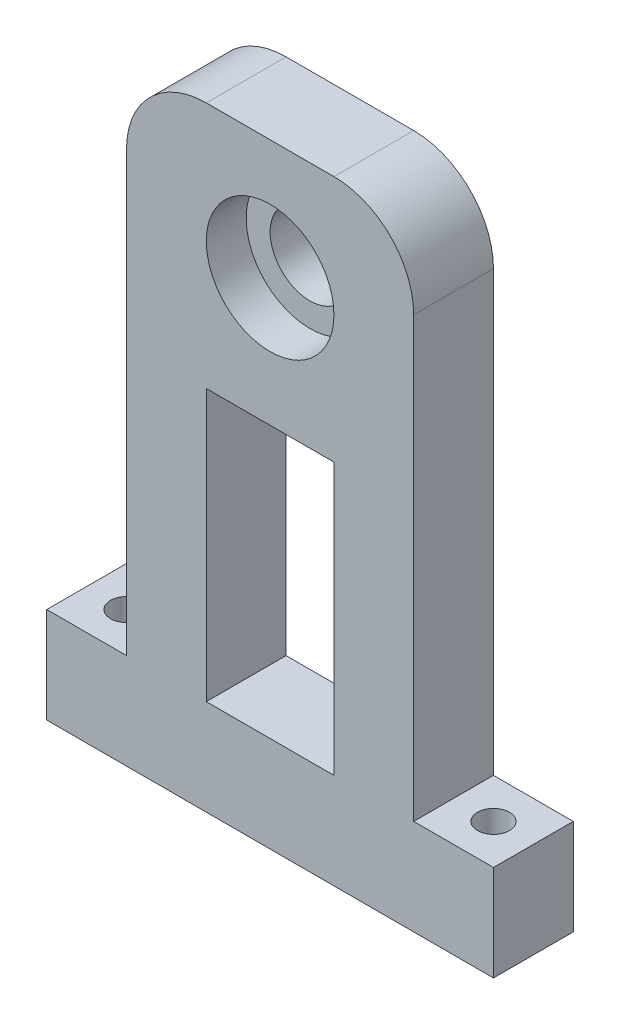
ISO-10303-21;
HEADER;
FILE_DESCRIPTION(('STEP AP214'),'2;1');
FILE_NAME('part.step','',(''),(''),'','','');
FILE_SCHEMA(('AUTOMOTIVE_DESIGN { 1 0 10303 214 1 1 1 1 }'));
ENDSEC;
DATA;
#1=APPLICATION_CONTEXT('core data for automotive mechanical design processes');
#2=APPLICATION_PROTOCOL_DEFINITION('international standard','automotive_design',2000,#1);
#3=PRODUCT_CONTEXT('',#1,'mechanical');
#4=PRODUCT('Part','Part','',(#3));
#5=PRODUCT_RELATED_PRODUCT_CATEGORY('part','',(#4));
#6=PRODUCT_DEFINITION_FORMATION('','',#4);
#7=PRODUCT_DEFINITION_CONTEXT('part definition',#1,'design');
#8=PRODUCT_DEFINITION('design','',#6,#7);
#9=PRODUCT_DEFINITION_SHAPE('','',#8);
#10=(LENGTH_UNIT() NAMED_UNIT(*) SI_UNIT(.MILLI.,.METRE.));
#11=(NAMED_UNIT(*) PLANE_ANGLE_UNIT() SI_UNIT($,.RADIAN.));
#12=(NAMED_UNIT(*) SI_UNIT($,.STERADIAN.) SOLID_ANGLE_UNIT());
#13=UNCERTAINTY_MEASURE_WITH_UNIT(LENGTH_MEASURE(1.E-05),#10,'distance_accuracy_value','');
#14=(GEOMETRIC_REPRESENTATION_CONTEXT(3) GLOBAL_UNCERTAINTY_ASSIGNED_CONTEXT((#13)) GLOBAL_UNIT_ASSIGNED_CONTEXT((#10,
#11,#12)) REPRESENTATION_CONTEXT('',''));
#15=CARTESIAN_POINT('',(0.,0.,0.));
#16=DIRECTION('',(0.,0.,1.));
#17=DIRECTION('',(1.,0.,0.));
#18=AXIS2_PLACEMENT_3D('',#15,#16,#17);
#19=CARTESIAN_POINT('',(8.37500000000009,53.,10.));
#20=DIRECTION('',(0.,-1.,0.));
#21=DIRECTION('',(1.,0.,0.));
#22=AXIS2_PLACEMENT_3D('',#19,#20,#21);
#23=PLANE('',#22);
#24=DIRECTION('',(-1.,0.,0.));
#25=VECTOR('',#24,1.);
#26=CARTESIAN_POINT('',(8.37500000000009,53.,0.));
#27=LINE('',#26,#25);
#28=CARTESIAN_POINT('',(-1.62499999999991,53.,0.));
#29=VERTEX_POINT('',#28);
#30=CARTESIAN_POINT('',(-17.6249999999999,53.,0.));
#31=VERTEX_POINT('',#30);
#32=EDGE_CURVE('E190',#29,#31,#27,.T.);
#33=ORIENTED_EDGE('',*,*,#32,.T.);
#34=DIRECTION('',(0.,0.,-1.));
#35=VECTOR('',#34,1.);
#36=CARTESIAN_POINT('',(-17.6249999999999,53.,10.));
#37=LINE('',#36,#35);
#38=CARTESIAN_POINT('',(-17.6249999999999,53.,10.));
#39=VERTEX_POINT('',#38);
#40=EDGE_CURVE('E256',#31,#39,#37,.F.);
#41=ORIENTED_EDGE('',*,*,#40,.T.);
#42=DIRECTION('',(-1.,0.,0.));
#43=VECTOR('',#42,1.);
#44=CARTESIAN_POINT('',(8.37500000000009,53.,10.));
#45=LINE('',#44,#43);
#46=CARTESIAN_POINT('',(-1.62499999999991,53.,10.));
#47=VERTEX_POINT('',#46);
#48=EDGE_CURVE('E193',#47,#39,#45,.T.);
#49=ORIENTED_EDGE('',*,*,#48,.F.);
#50=DIRECTION('',(0.,0.,-1.));
#51=VECTOR('',#50,1.);
#52=CARTESIAN_POINT('',(-1.62499999999991,53.,10.));
#53=LINE('',#52,#51);
#54=EDGE_CURVE('E253',#47,#29,#53,.T.);
#55=ORIENTED_EDGE('',*,*,#54,.T.);
#56=EDGE_LOOP('',(#33,#41,#49,#55));
#57=FACE_BOUND('',#56,.T.);
#58=ADVANCED_FACE('F34',(#57),#23,.F.);
#59=CARTESIAN_POINT('',(-27.6249999999999,53.,10.));
#60=DIRECTION('',(1.,0.,0.));
#61=DIRECTION('',(0.,1.,0.));
#62=AXIS2_PLACEMENT_3D('',#59,#60,#61);
#63=PLANE('',#62);
#64=DIRECTION('',(0.,-1.,0.));
#65=VECTOR('',#64,1.);
#66=CARTESIAN_POINT('',(-27.6249999999999,53.,10.));
#67=LINE('',#66,#65);
#68=CARTESIAN_POINT('',(-27.6249999999999,43.,10.));
#69=VERTEX_POINT('',#68);
#70=CARTESIAN_POINT('',(-27.6249999999999,-12.,10.));
#71=VERTEX_POINT('',#70);
#72=EDGE_CURVE('E196',#69,#71,#67,.T.);
#73=ORIENTED_EDGE('',*,*,#72,.F.);
#74=DIRECTION('',(0.,0.,-1.));
#75=VECTOR('',#74,1.);
#76=CARTESIAN_POINT('',(-27.6249999999999,43.,10.));
#77=LINE('',#76,#75);
#78=CARTESIAN_POINT('',(-27.6249999999999,43.,0.));
#79=VERTEX_POINT('',#78);
#80=EDGE_CURVE('E246',#69,#79,#77,.T.);
#81=ORIENTED_EDGE('',*,*,#80,.T.);
#82=DIRECTION('',(0.,-1.,0.));
#83=VECTOR('',#82,1.);
#84=CARTESIAN_POINT('',(-27.6249999999999,53.,0.));
#85=LINE('',#84,#83);
#86=CARTESIAN_POINT('',(-27.6249999999999,-12.,0.));
#87=VERTEX_POINT('',#86);
#88=EDGE_CURVE('E215',#79,#87,#85,.T.);
#89=ORIENTED_EDGE('',*,*,#88,.T.);
#90=DIRECTION('',(0.,0.,-1.));
#91=VECTOR('',#90,1.);
#92=CARTESIAN_POINT('',(-27.6249999999999,-12.,10.));
#93=LINE('',#92,#91);
#94=EDGE_CURVE('E243',#71,#87,#93,.T.);
#95=ORIENTED_EDGE('',*,*,#94,.F.);
#96=EDGE_LOOP('',(#73,#81,#89,#95));
#97=FACE_BOUND('',#96,.T.);
#98=ADVANCED_FACE('F270',(#97),#63,.F.);
#99=CARTESIAN_POINT('',(-27.6249999999999,-12.,10.));
#100=DIRECTION('',(0.,-1.,0.));
#101=DIRECTION('',(1.,0.,0.));
#102=AXIS2_PLACEMENT_3D('',#99,#100,#101);
#103=PLANE('',#102);
#104=CARTESIAN_POINT('',(-32.6249999999999,-12.,5.));
#105=DIRECTION('',(0.,1.,0.));
#106=DIRECTION('',(0.,0.,1.));
#107=AXIS2_PLACEMENT_3D('',#104,#105,#106);
#108=CIRCLE('',#107,2.);
#109=CARTESIAN_POINT('',(-32.6249999999999,-12.,7.));
#110=VERTEX_POINT('',#109);
#111=EDGE_CURVE('E177',#110,#110,#108,.T.);
#112=ORIENTED_EDGE('',*,*,#111,.F.);
#113=EDGE_LOOP('',(#112));
#114=FACE_BOUND('',#113,.T.);
#115=DIRECTION('',(-1.,0.,0.));
#116=VECTOR('',#115,1.);
#117=CARTESIAN_POINT('',(-27.6249999999999,-12.,0.));
#118=LINE('',#117,#116);
#119=CARTESIAN_POINT('',(-37.6249999999999,-12.,0.));
#120=VERTEX_POINT('',#119);
#121=EDGE_CURVE('E217',#87,#120,#118,.T.);
#122=ORIENTED_EDGE('',*,*,#121,.T.);
#123=DIRECTION('',(0.,0.,-1.));
#124=VECTOR('',#123,1.);
#125=CARTESIAN_POINT('',(-37.6249999999999,-12.,10.));
#126=LINE('',#125,#124);
#127=CARTESIAN_POINT('',(-37.6249999999999,-12.,10.));
#128=VERTEX_POINT('',#127);
#129=EDGE_CURVE('E240',#128,#120,#126,.T.);
#130=ORIENTED_EDGE('',*,*,#129,.F.);
#131=DIRECTION('',(-1.,0.,0.));
#132=VECTOR('',#131,1.);
#133=CARTESIAN_POINT('',(-27.6249999999999,-12.,10.));
#134=LINE('',#133,#132);
#135=EDGE_CURVE('E199',#71,#128,#134,.T.);
#136=ORIENTED_EDGE('',*,*,#135,.F.);
#137=ORIENTED_EDGE('',*,*,#94,.T.);
#138=EDGE_LOOP('',(#122,#130,#136,#137));
#139=FACE_BOUND('',#138,.T.);
#140=ADVANCED_FACE('F308',(#114,#139),#103,.F.);
#141=CARTESIAN_POINT('',(-37.6249999999999,-12.,10.));
#142=DIRECTION('',(1.,0.,0.));
#143=DIRECTION('',(0.,0.,-1.));
#144=AXIS2_PLACEMENT_3D('',#141,#142,#143);
#145=PLANE('',#144);
#146=DIRECTION('',(0.,-1.,0.));
#147=VECTOR('',#146,1.);
#148=CARTESIAN_POINT('',(-37.6249999999999,-12.,0.));
#149=LINE('',#148,#147);
#150=CARTESIAN_POINT('',(-37.6249999999999,-24.,0.));
#151=VERTEX_POINT('',#150);
#152=EDGE_CURVE('E219',#120,#151,#149,.T.);
#153=ORIENTED_EDGE('',*,*,#152,.T.);
#154=DIRECTION('',(0.,0.,-1.));
#155=VECTOR('',#154,1.);
#156=CARTESIAN_POINT('',(-37.6249999999999,-24.,10.));
#157=LINE('',#156,#155);
#158=CARTESIAN_POINT('',(-37.6249999999999,-24.,10.));
#159=VERTEX_POINT('',#158);
#160=EDGE_CURVE('E237',#159,#151,#157,.T.);
#161=ORIENTED_EDGE('',*,*,#160,.F.);
#162=DIRECTION('',(0.,-1.,0.));
#163=VECTOR('',#162,1.);
#164=CARTESIAN_POINT('',(-37.6249999999999,-12.,10.));
#165=LINE('',#164,#163);
#166=EDGE_CURVE('E201',#128,#159,#165,.T.);
#167=ORIENTED_EDGE('',*,*,#166,.F.);
#168=ORIENTED_EDGE('',*,*,#129,.T.);
#169=EDGE_LOOP('',(#153,#161,#167,#168));
#170=FACE_BOUND('',#169,.T.);
#171=ADVANCED_FACE('F305',(#170),#145,.F.);
#172=CARTESIAN_POINT('',(-37.6249999999999,-24.,10.));
#173=DIRECTION('',(0.,1.,0.));
#174=DIRECTION('',(-1.,0.,0.));
#175=AXIS2_PLACEMENT_3D('',#172,#173,#174);
#176=PLANE('',#175);
#177=CARTESIAN_POINT('',(-32.6249999999999,-24.,5.));
#178=DIRECTION('',(0.,1.,0.));
#179=DIRECTION('',(-1.,0.,0.));
#180=AXIS2_PLACEMENT_3D('',#177,#178,#179);
#181=CIRCLE('',#180,2.);
#182=CARTESIAN_POINT('',(-34.6249999999999,-24.,5.));
#183=VERTEX_POINT('',#182);
#184=EDGE_CURVE('E38',#183,#183,#181,.T.);
#185=ORIENTED_EDGE('',*,*,#184,.T.);
#186=EDGE_LOOP('',(#185));
#187=FACE_BOUND('',#186,.T.);
#188=CARTESIAN_POINT('',(13.3750000000001,-24.,5.));
#189=DIRECTION('',(0.,1.,0.));
#190=DIRECTION('',(-1.,0.,0.));
#191=AXIS2_PLACEMENT_3D('',#188,#189,#190);
#192=CIRCLE('',#191,2.);
#193=CARTESIAN_POINT('',(11.3750000000001,-24.,5.));
#194=VERTEX_POINT('',#193);
#195=EDGE_CURVE('E183',#194,#194,#192,.T.);
#196=ORIENTED_EDGE('',*,*,#195,.T.);
#197=EDGE_LOOP('',(#196));
#198=FACE_BOUND('',#197,.T.);
#199=DIRECTION('',(1.,0.,0.));
#200=VECTOR('',#199,1.);
#201=CARTESIAN_POINT('',(-37.6249999999999,-24.,0.));
#202=LINE('',#201,#200);
#203=CARTESIAN_POINT('',(18.3750000000001,-24.,0.));
#204=VERTEX_POINT('',#203);
#205=EDGE_CURVE('E221',#151,#204,#202,.T.);
#206=ORIENTED_EDGE('',*,*,#205,.T.);
#207=DIRECTION('',(0.,0.,-1.));
#208=VECTOR('',#207,1.);
#209=CARTESIAN_POINT('',(18.3750000000001,-24.,10.));
#210=LINE('',#209,#208);
#211=CARTESIAN_POINT('',(18.3750000000001,-24.,10.));
#212=VERTEX_POINT('',#211);
#213=EDGE_CURVE('E234',#212,#204,#210,.T.);
#214=ORIENTED_EDGE('',*,*,#213,.F.);
#215=DIRECTION('',(1.,0.,0.));
#216=VECTOR('',#215,1.);
#217=CARTESIAN_POINT('',(-37.6249999999999,-24.,10.));
#218=LINE('',#217,#216);
#219=EDGE_CURVE('E203',#159,#212,#218,.T.);
#220=ORIENTED_EDGE('',*,*,#219,.F.);
#221=ORIENTED_EDGE('',*,*,#160,.T.);
#222=EDGE_LOOP('',(#206,#214,#220,#221));
#223=FACE_BOUND('',#222,.T.);
#224=ADVANCED_FACE('F301',(#187,#198,#223),#176,.F.);
#225=CARTESIAN_POINT('',(18.3750000000001,-24.,10.));
#226=DIRECTION('',(-1.,0.,0.));
#227=DIRECTION('',(0.,-1.,0.));
#228=AXIS2_PLACEMENT_3D('',#225,#226,#227);
#229=PLANE('',#228);
#230=DIRECTION('',(0.,1.,0.));
#231=VECTOR('',#230,1.);
#232=CARTESIAN_POINT('',(18.3750000000001,-24.,0.));
#233=LINE('',#232,#231);
#234=CARTESIAN_POINT('',(18.3750000000001,-12.,0.));
#235=VERTEX_POINT('',#234);
#236=EDGE_CURVE('E223',#204,#235,#233,.T.);
#237=ORIENTED_EDGE('',*,*,#236,.T.);
#238=DIRECTION('',(0.,0.,-1.));
#239=VECTOR('',#238,1.);
#240=CARTESIAN_POINT('',(18.3750000000001,-12.,10.));
#241=LINE('',#240,#239);
#242=CARTESIAN_POINT('',(18.3750000000001,-12.,10.));
#243=VERTEX_POINT('',#242);
#244=EDGE_CURVE('E231',#243,#235,#241,.T.);
#245=ORIENTED_EDGE('',*,*,#244,.F.);
#246=DIRECTION('',(0.,1.,0.));
#247=VECTOR('',#246,1.);
#248=CARTESIAN_POINT('',(18.3750000000001,-24.,10.));
#249=LINE('',#248,#247);
#250=EDGE_CURVE('E205',#212,#243,#249,.T.);
#251=ORIENTED_EDGE('',*,*,#250,.F.);
#252=ORIENTED_EDGE('',*,*,#213,.T.);
#253=EDGE_LOOP('',(#237,#245,#251,#252));
#254=FACE_BOUND('',#253,.T.);
#255=ADVANCED_FACE('F296',(#254),#229,.F.);
#256=CARTESIAN_POINT('',(18.3750000000001,-12.,10.));
#257=DIRECTION('',(0.,-1.,0.));
#258=DIRECTION('',(1.,0.,0.));
#259=AXIS2_PLACEMENT_3D('',#256,#257,#258);
#260=PLANE('',#259);
#261=CARTESIAN_POINT('',(13.3750000000001,-12.,5.));
#262=DIRECTION('',(0.,1.,0.));
#263=DIRECTION('',(-1.,0.,0.));
#264=AXIS2_PLACEMENT_3D('',#261,#262,#263);
#265=CIRCLE('',#264,2.);
#266=CARTESIAN_POINT('',(11.3750000000001,-12.,5.));
#267=VERTEX_POINT('',#266);
#268=EDGE_CURVE('E180',#267,#267,#265,.T.);
#269=ORIENTED_EDGE('',*,*,#268,.F.);
#270=EDGE_LOOP('',(#269));
#271=FACE_BOUND('',#270,.T.);
#272=DIRECTION('',(-1.,0.,0.));
#273=VECTOR('',#272,1.);
#274=CARTESIAN_POINT('',(18.3750000000001,-12.,0.));
#275=LINE('',#274,#273);
#276=CARTESIAN_POINT('',(8.37500000000009,-12.,0.));
#277=VERTEX_POINT('',#276);
#278=EDGE_CURVE('E225',#235,#277,#275,.T.);
#279=ORIENTED_EDGE('',*,*,#278,.T.);
#280=DIRECTION('',(0.,0.,-1.));
#281=VECTOR('',#280,1.);
#282=CARTESIAN_POINT('',(8.37500000000009,-12.,10.));
#283=LINE('',#282,#281);
#284=CARTESIAN_POINT('',(8.37500000000009,-12.,10.));
#285=VERTEX_POINT('',#284);
#286=EDGE_CURVE('E212',#285,#277,#283,.T.);
#287=ORIENTED_EDGE('',*,*,#286,.F.);
#288=DIRECTION('',(-1.,0.,0.));
#289=VECTOR('',#288,1.);
#290=CARTESIAN_POINT('',(18.3750000000001,-12.,10.));
#291=LINE('',#290,#289);
#292=EDGE_CURVE('E207',#243,#285,#291,.T.);
#293=ORIENTED_EDGE('',*,*,#292,.F.);
#294=ORIENTED_EDGE('',*,*,#244,.T.);
#295=EDGE_LOOP('',(#279,#287,#293,#294));
#296=FACE_BOUND('',#295,.T.);
#297=ADVANCED_FACE('F290',(#271,#296),#260,.F.);
#298=CARTESIAN_POINT('',(8.37500000000009,-12.,10.));
#299=DIRECTION('',(-1.,0.,0.));
#300=DIRECTION('',(0.,-1.,0.));
#301=AXIS2_PLACEMENT_3D('',#298,#299,#300);
#302=PLANE('',#301);
#303=DIRECTION('',(0.,1.,0.));
#304=VECTOR('',#303,1.);
#305=CARTESIAN_POINT('',(8.37500000000009,-12.,0.));
#306=LINE('',#305,#304);
#307=CARTESIAN_POINT('',(8.37500000000009,43.,0.));
#308=VERTEX_POINT('',#307);
#309=EDGE_CURVE('E197',#277,#308,#306,.T.);
#310=ORIENTED_EDGE('',*,*,#309,.T.);
#311=DIRECTION('',(0.,0.,-1.));
#312=VECTOR('',#311,1.);
#313=CARTESIAN_POINT('',(8.37500000000009,43.,10.));
#314=LINE('',#313,#312);
#315=CARTESIAN_POINT('',(8.37500000000009,43.,10.));
#316=VERTEX_POINT('',#315);
#317=EDGE_CURVE('E11',#308,#316,#314,.F.);
#318=ORIENTED_EDGE('',*,*,#317,.T.);
#319=DIRECTION('',(0.,1.,0.));
#320=VECTOR('',#319,1.);
#321=CARTESIAN_POINT('',(8.37500000000009,-12.,10.));
#322=LINE('',#321,#320);
#323=EDGE_CURVE('E209',#285,#316,#322,.T.);
#324=ORIENTED_EDGE('',*,*,#323,.F.);
#325=ORIENTED_EDGE('',*,*,#286,.T.);
#326=EDGE_LOOP('',(#310,#318,#324,#325));
#327=FACE_BOUND('',#326,.T.);
#328=ADVANCED_FACE('F285',(#327),#302,.F.);
#329=CARTESIAN_POINT('',(0.,0.,10.));
#330=DIRECTION('',(0.,0.,1.));
#331=DIRECTION('',(1.,0.,0.));
#332=AXIS2_PLACEMENT_3D('',#329,#330,#331);
#333=PLANE('',#332);
#334=DIRECTION('',(-1.,0.,0.));
#335=VECTOR('',#334,1.);
#336=CARTESIAN_POINT('',(-17.6249999999999,22.,10.));
#337=LINE('',#336,#335);
#338=CARTESIAN_POINT('',(-1.6249999999999,22.,10.));
#339=VERTEX_POINT('',#338);
#340=CARTESIAN_POINT('',(-17.6249999999999,22.,10.));
#341=VERTEX_POINT('',#340);
#342=EDGE_CURVE('E50',#339,#341,#337,.T.);
#343=ORIENTED_EDGE('',*,*,#342,.F.);
#344=DIRECTION('',(0.,1.,0.));
#345=VECTOR('',#344,1.);
#346=CARTESIAN_POINT('',(-1.6249999999999,22.,10.));
#347=LINE('',#346,#345);
#348=CARTESIAN_POINT('',(-1.6249999999999,-12.,10.));
#349=VERTEX_POINT('',#348);
#350=EDGE_CURVE('E153',#349,#339,#347,.T.);
#351=ORIENTED_EDGE('',*,*,#350,.F.);
#352=DIRECTION('',(1.,0.,0.));
#353=VECTOR('',#352,1.);
#354=CARTESIAN_POINT('',(-1.6249999999999,-12.,10.));
#355=LINE('',#354,#353);
#356=CARTESIAN_POINT('',(-17.6249999999999,-12.,10.));
#357=VERTEX_POINT('',#356);
#358=EDGE_CURVE('E156',#357,#349,#355,.T.);
#359=ORIENTED_EDGE('',*,*,#358,.F.);
#360=DIRECTION('',(0.,-1.,0.));
#361=VECTOR('',#360,1.);
#362=CARTESIAN_POINT('',(-17.6249999999999,-12.,10.));
#363=LINE('',#362,#361);
#364=EDGE_CURVE('E162',#341,#357,#363,.T.);
#365=ORIENTED_EDGE('',*,*,#364,.F.);
#366=EDGE_LOOP('',(#343,#351,#359,#365));
#367=FACE_BOUND('',#366,.T.);
#368=CARTESIAN_POINT('',(-9.62499999999991,38.,10.));
#369=DIRECTION('',(0.,0.,1.));
#370=DIRECTION('',(1.,0.,0.));
#371=AXIS2_PLACEMENT_3D('',#368,#369,#370);
#372=CIRCLE('',#371,8.);
#373=CARTESIAN_POINT('',(-1.62499999999991,38.,10.));
#374=VERTEX_POINT('',#373);
#375=EDGE_CURVE('E186',#374,#374,#372,.T.);
#376=ORIENTED_EDGE('',*,*,#375,.F.);
#377=EDGE_LOOP('',(#376));
#378=FACE_BOUND('',#377,.T.);
#379=ORIENTED_EDGE('',*,*,#48,.T.);
#380=CARTESIAN_POINT('',(-17.6249999999999,43.,10.));
#381=DIRECTION('',(0.,0.,1.));
#382=DIRECTION('',(1.,0.,0.));
#383=AXIS2_PLACEMENT_3D('',#380,#381,#382);
#384=CIRCLE('',#383,10.);
#385=EDGE_CURVE('E43',#39,#69,#384,.T.);
#386=ORIENTED_EDGE('',*,*,#385,.T.);
#387=ORIENTED_EDGE('',*,*,#72,.T.);
#388=ORIENTED_EDGE('',*,*,#135,.T.);
#389=ORIENTED_EDGE('',*,*,#166,.T.);
#390=ORIENTED_EDGE('',*,*,#219,.T.);
#391=ORIENTED_EDGE('',*,*,#250,.T.);
#392=ORIENTED_EDGE('',*,*,#292,.T.);
#393=ORIENTED_EDGE('',*,*,#323,.T.);
#394=CARTESIAN_POINT('',(-1.62499999999991,43.,10.));
#395=DIRECTION('',(0.,0.,1.));
#396=DIRECTION('',(1.,0.,0.));
#397=AXIS2_PLACEMENT_3D('',#394,#395,#396);
#398=CIRCLE('',#397,10.);
#399=EDGE_CURVE('E258',#316,#47,#398,.T.);
#400=ORIENTED_EDGE('',*,*,#399,.T.);
#401=EDGE_LOOP('',(#379,#386,#387,#388,#389,#390,#391,#392,#393,#400));
#402=FACE_BOUND('',#401,.T.);
#403=ADVANCED_FACE('F263',(#367,#378,#402),#333,.T.);
#404=CARTESIAN_POINT('',(0.,0.,0.));
#405=DIRECTION('',(0.,0.,1.));
#406=DIRECTION('',(1.,0.,0.));
#407=AXIS2_PLACEMENT_3D('',#404,#405,#406);
#408=PLANE('',#407);
#409=DIRECTION('',(0.,1.,0.));
#410=VECTOR('',#409,1.);
#411=CARTESIAN_POINT('',(-1.6249999999999,22.,0.));
#412=LINE('',#411,#410);
#413=CARTESIAN_POINT('',(-1.6249999999999,-12.,0.));
#414=VERTEX_POINT('',#413);
#415=CARTESIAN_POINT('',(-1.6249999999999,22.,0.));
#416=VERTEX_POINT('',#415);
#417=EDGE_CURVE('E143',#414,#416,#412,.T.);
#418=ORIENTED_EDGE('',*,*,#417,.T.);
#419=DIRECTION('',(-1.,0.,0.));
#420=VECTOR('',#419,1.);
#421=CARTESIAN_POINT('',(-17.6249999999999,22.,0.));
#422=LINE('',#421,#420);
#423=CARTESIAN_POINT('',(-17.6249999999999,22.,0.));
#424=VERTEX_POINT('',#423);
#425=EDGE_CURVE('E137',#416,#424,#422,.T.);
#426=ORIENTED_EDGE('',*,*,#425,.T.);
#427=DIRECTION('',(0.,-1.,0.));
#428=VECTOR('',#427,1.);
#429=CARTESIAN_POINT('',(-17.6249999999999,-12.,0.));
#430=LINE('',#429,#428);
#431=CARTESIAN_POINT('',(-17.6249999999999,-12.,0.));
#432=VERTEX_POINT('',#431);
#433=EDGE_CURVE('E146',#424,#432,#430,.T.);
#434=ORIENTED_EDGE('',*,*,#433,.T.);
#435=DIRECTION('',(1.,0.,0.));
#436=VECTOR('',#435,1.);
#437=CARTESIAN_POINT('',(-1.6249999999999,-12.,0.));
#438=LINE('',#437,#436);
#439=EDGE_CURVE('E58',#432,#414,#438,.T.);
#440=ORIENTED_EDGE('',*,*,#439,.T.);
#441=EDGE_LOOP('',(#418,#426,#434,#440));
#442=FACE_BOUND('',#441,.T.);
#443=CARTESIAN_POINT('',(-9.62499999999991,38.,0.));
#444=DIRECTION('',(0.,0.,1.));
#445=DIRECTION('',(1.,0.,0.));
#446=AXIS2_PLACEMENT_3D('',#443,#444,#445);
#447=CIRCLE('',#446,5.);
#448=CARTESIAN_POINT('',(-4.62499999999991,38.,0.));
#449=VERTEX_POINT('',#448);
#450=EDGE_CURVE('E174',#449,#449,#447,.T.);
#451=ORIENTED_EDGE('',*,*,#450,.T.);
#452=EDGE_LOOP('',(#451));
#453=FACE_BOUND('',#452,.T.);
#454=ORIENTED_EDGE('',*,*,#88,.F.);
#455=CARTESIAN_POINT('',(-17.6249999999999,43.,0.));
#456=DIRECTION('',(0.,0.,1.));
#457=DIRECTION('',(1.,0.,0.));
#458=AXIS2_PLACEMENT_3D('',#455,#456,#457);
#459=CIRCLE('',#458,10.);
#460=EDGE_CURVE('E251',#79,#31,#459,.F.);
#461=ORIENTED_EDGE('',*,*,#460,.T.);
#462=ORIENTED_EDGE('',*,*,#32,.F.);
#463=CARTESIAN_POINT('',(-1.62499999999991,43.,0.));
#464=DIRECTION('',(0.,0.,1.));
#465=DIRECTION('',(1.,0.,0.));
#466=AXIS2_PLACEMENT_3D('',#463,#464,#465);
#467=CIRCLE('',#466,10.);
#468=EDGE_CURVE('E249',#29,#308,#467,.F.);
#469=ORIENTED_EDGE('',*,*,#468,.T.);
#470=ORIENTED_EDGE('',*,*,#309,.F.);
#471=ORIENTED_EDGE('',*,*,#278,.F.);
#472=ORIENTED_EDGE('',*,*,#236,.F.);
#473=ORIENTED_EDGE('',*,*,#205,.F.);
#474=ORIENTED_EDGE('',*,*,#152,.F.);
#475=ORIENTED_EDGE('',*,*,#121,.F.);
#476=EDGE_LOOP('',(#454,#461,#462,#469,#470,#471,#472,#473,#474,#475));
#477=FACE_BOUND('',#476,.T.);
#478=ADVANCED_FACE('F150',(#442,#453,#477),#408,.F.);
#479=CARTESIAN_POINT('',(-9.62499999999991,38.,5.));
#480=DIRECTION('',(0.,0.,1.));
#481=DIRECTION('',(1.,0.,0.));
#482=AXIS2_PLACEMENT_3D('',#479,#480,#481);
#483=CYLINDRICAL_SURFACE('',#482,8.);
#484=CARTESIAN_POINT('',(-9.62499999999991,38.,5.));
#485=DIRECTION('',(0.,0.,1.));
#486=DIRECTION('',(1.,0.,0.));
#487=AXIS2_PLACEMENT_3D('',#484,#485,#486);
#488=CIRCLE('',#487,8.);
#489=CARTESIAN_POINT('',(-1.62499999999991,38.,5.));
#490=VERTEX_POINT('',#489);
#491=EDGE_CURVE('E187',#490,#490,#488,.T.);
#492=ORIENTED_EDGE('',*,*,#491,.F.);
#493=EDGE_LOOP('',(#492));
#494=FACE_BOUND('',#493,.T.);
#495=ORIENTED_EDGE('',*,*,#375,.T.);
#496=EDGE_LOOP('',(#495));
#497=FACE_BOUND('',#496,.T.);
#498=ADVANCED_FACE('F330',(#494,#497),#483,.F.);
#499=CARTESIAN_POINT('',(-9.62499999999991,38.,5.));
#500=DIRECTION('',(0.,0.,1.));
#501=DIRECTION('',(1.,0.,0.));
#502=AXIS2_PLACEMENT_3D('',#499,#500,#501);
#503=PLANE('',#502);
#504=CARTESIAN_POINT('',(-9.62499999999991,38.,5.));
#505=DIRECTION('',(0.,0.,1.));
#506=DIRECTION('',(1.,0.,0.));
#507=AXIS2_PLACEMENT_3D('',#504,#505,#506);
#508=CIRCLE('',#507,5.);
#509=CARTESIAN_POINT('',(-4.62499999999991,38.,5.));
#510=VERTEX_POINT('',#509);
#511=EDGE_CURVE('E168',#510,#510,#508,.T.);
#512=ORIENTED_EDGE('',*,*,#511,.F.);
#513=EDGE_LOOP('',(#512));
#514=FACE_BOUND('',#513,.T.);
#515=ORIENTED_EDGE('',*,*,#491,.T.);
#516=EDGE_LOOP('',(#515));
#517=FACE_BOUND('',#516,.T.);
#518=ADVANCED_FACE('F324',(#514,#517),#503,.T.);
#519=CARTESIAN_POINT('',(-17.6249999999999,43.,10.));
#520=DIRECTION('',(0.,0.,-1.));
#521=DIRECTION('',(-1.,0.,0.));
#522=AXIS2_PLACEMENT_3D('',#519,#520,#521);
#523=CYLINDRICAL_SURFACE('',#522,10.);
#524=ORIENTED_EDGE('',*,*,#385,.F.);
#525=ORIENTED_EDGE('',*,*,#40,.F.);
#526=ORIENTED_EDGE('',*,*,#460,.F.);
#527=ORIENTED_EDGE('',*,*,#80,.F.);
#528=EDGE_LOOP('',(#524,#525,#526,#527));
#529=FACE_BOUND('',#528,.T.);
#530=ADVANCED_FACE('F273',(#529),#523,.T.);
#531=CARTESIAN_POINT('',(-1.62499999999991,43.,10.));
#532=DIRECTION('',(0.,0.,-1.));
#533=DIRECTION('',(-1.,0.,0.));
#534=AXIS2_PLACEMENT_3D('',#531,#532,#533);
#535=CYLINDRICAL_SURFACE('',#534,10.);
#536=ORIENTED_EDGE('',*,*,#399,.F.);
#537=ORIENTED_EDGE('',*,*,#317,.F.);
#538=ORIENTED_EDGE('',*,*,#468,.F.);
#539=ORIENTED_EDGE('',*,*,#54,.F.);
#540=EDGE_LOOP('',(#536,#537,#538,#539));
#541=FACE_BOUND('',#540,.T.);
#542=ADVANCED_FACE('F36',(#541),#535,.T.);
#543=CARTESIAN_POINT('',(13.3750000000001,-34.,5.));
#544=DIRECTION('',(0.,1.,0.));
#545=DIRECTION('',(-1.,0.,0.));
#546=AXIS2_PLACEMENT_3D('',#543,#544,#545);
#547=CYLINDRICAL_SURFACE('',#546,2.);
#548=ORIENTED_EDGE('',*,*,#268,.T.);
#549=EDGE_LOOP('',(#548));
#550=FACE_BOUND('',#549,.T.);
#551=ORIENTED_EDGE('',*,*,#195,.F.);
#552=EDGE_LOOP('',(#551));
#553=FACE_BOUND('',#552,.T.);
#554=ADVANCED_FACE('F329',(#550,#553),#547,.F.);
#555=CARTESIAN_POINT('',(-32.6249999999999,-35.,5.));
#556=DIRECTION('',(0.,1.,0.));
#557=DIRECTION('',(0.,0.,1.));
#558=AXIS2_PLACEMENT_3D('',#555,#556,#557);
#559=CYLINDRICAL_SURFACE('',#558,2.);
#560=ORIENTED_EDGE('',*,*,#111,.T.);
#561=EDGE_LOOP('',(#560));
#562=FACE_BOUND('',#561,.T.);
#563=ORIENTED_EDGE('',*,*,#184,.F.);
#564=EDGE_LOOP('',(#563));
#565=FACE_BOUND('',#564,.T.);
#566=ADVANCED_FACE('F365',(#562,#565),#559,.F.);
#567=CARTESIAN_POINT('',(-9.62499999999991,38.,-5.));
#568=DIRECTION('',(0.,0.,1.));
#569=DIRECTION('',(1.,0.,0.));
#570=AXIS2_PLACEMENT_3D('',#567,#568,#569);
#571=CYLINDRICAL_SURFACE('',#570,5.);
#572=ORIENTED_EDGE('',*,*,#511,.T.);
#573=EDGE_LOOP('',(#572));
#574=FACE_BOUND('',#573,.T.);
#575=ORIENTED_EDGE('',*,*,#450,.F.);
#576=EDGE_LOOP('',(#575));
#577=FACE_BOUND('',#576,.T.);
#578=ADVANCED_FACE('F370',(#574,#577),#571,.F.);
#579=CARTESIAN_POINT('',(-17.6249999999999,22.,0.));
#580=DIRECTION('',(0.,1.,0.));
#581=DIRECTION('',(0.,0.,1.));
#582=AXIS2_PLACEMENT_3D('',#579,#580,#581);
#583=PLANE('',#582);
#584=ORIENTED_EDGE('',*,*,#342,.T.);
#585=DIRECTION('',(0.,0.,1.));
#586=VECTOR('',#585,1.);
#587=CARTESIAN_POINT('',(-17.6249999999999,22.,0.));
#588=LINE('',#587,#586);
#589=EDGE_CURVE('E133',#424,#341,#588,.T.);
#590=ORIENTED_EDGE('',*,*,#589,.F.);
#591=ORIENTED_EDGE('',*,*,#425,.F.);
#592=DIRECTION('',(0.,0.,1.));
#593=VECTOR('',#592,1.);
#594=CARTESIAN_POINT('',(-1.6249999999999,22.,0.));
#595=LINE('',#594,#593);
#596=EDGE_CURVE('E166',#416,#339,#595,.T.);
#597=ORIENTED_EDGE('',*,*,#596,.T.);
#598=EDGE_LOOP('',(#584,#590,#591,#597));
#599=FACE_BOUND('',#598,.T.);
#600=ADVANCED_FACE('F135',(#599),#583,.F.);
#601=CARTESIAN_POINT('',(-1.6249999999999,22.,0.));
#602=DIRECTION('',(1.,0.,0.));
#603=DIRECTION('',(0.,1.,0.));
#604=AXIS2_PLACEMENT_3D('',#601,#602,#603);
#605=PLANE('',#604);
#606=ORIENTED_EDGE('',*,*,#350,.T.);
#607=ORIENTED_EDGE('',*,*,#596,.F.);
#608=ORIENTED_EDGE('',*,*,#417,.F.);
#609=DIRECTION('',(0.,0.,1.));
#610=VECTOR('',#609,1.);
#611=CARTESIAN_POINT('',(-1.6249999999999,-12.,0.));
#612=LINE('',#611,#610);
#613=EDGE_CURVE('E169',#414,#349,#612,.T.);
#614=ORIENTED_EDGE('',*,*,#613,.T.);
#615=EDGE_LOOP('',(#606,#607,#608,#614));
#616=FACE_BOUND('',#615,.T.);
#617=ADVANCED_FACE('F382',(#616),#605,.F.);
#618=CARTESIAN_POINT('',(-1.6249999999999,-12.,0.));
#619=DIRECTION('',(0.,-1.,0.));
#620=DIRECTION('',(1.,0.,0.));
#621=AXIS2_PLACEMENT_3D('',#618,#619,#620);
#622=PLANE('',#621);
#623=ORIENTED_EDGE('',*,*,#358,.T.);
#624=ORIENTED_EDGE('',*,*,#613,.F.);
#625=ORIENTED_EDGE('',*,*,#439,.F.);
#626=DIRECTION('',(0.,0.,1.));
#627=VECTOR('',#626,1.);
#628=CARTESIAN_POINT('',(-17.6249999999999,-12.,0.));
#629=LINE('',#628,#627);
#630=EDGE_CURVE('E142',#432,#357,#629,.T.);
#631=ORIENTED_EDGE('',*,*,#630,.T.);
#632=EDGE_LOOP('',(#623,#624,#625,#631));
#633=FACE_BOUND('',#632,.T.);
#634=ADVANCED_FACE('F385',(#633),#622,.F.);
#635=CARTESIAN_POINT('',(-17.6249999999999,-12.,0.));
#636=DIRECTION('',(-1.,0.,0.));
#637=DIRECTION('',(0.,0.,1.));
#638=AXIS2_PLACEMENT_3D('',#635,#636,#637);
#639=PLANE('',#638);
#640=ORIENTED_EDGE('',*,*,#364,.T.);
#641=ORIENTED_EDGE('',*,*,#630,.F.);
#642=ORIENTED_EDGE('',*,*,#433,.F.);
#643=ORIENTED_EDGE('',*,*,#589,.T.);
#644=EDGE_LOOP('',(#640,#641,#642,#643));
#645=FACE_BOUND('',#644,.T.);
#646=ADVANCED_FACE('F147',(#645),#639,.F.);
#647=CLOSED_SHELL('',(#58,#98,#140,#171,#224,#255,#297,#328,#403,#478,#498,#518,#530,#542,#554,
#566,#578,#600,#617,#634,#646));
#648=MANIFOLD_SOLID_BREP('B2',#647);
#649=ADVANCED_BREP_SHAPE_REPRESENTATION('',(#18,#648),#14);
#650=SHAPE_DEFINITION_REPRESENTATION(#9,#649);
ENDSEC;
END-ISO-10303-21;
